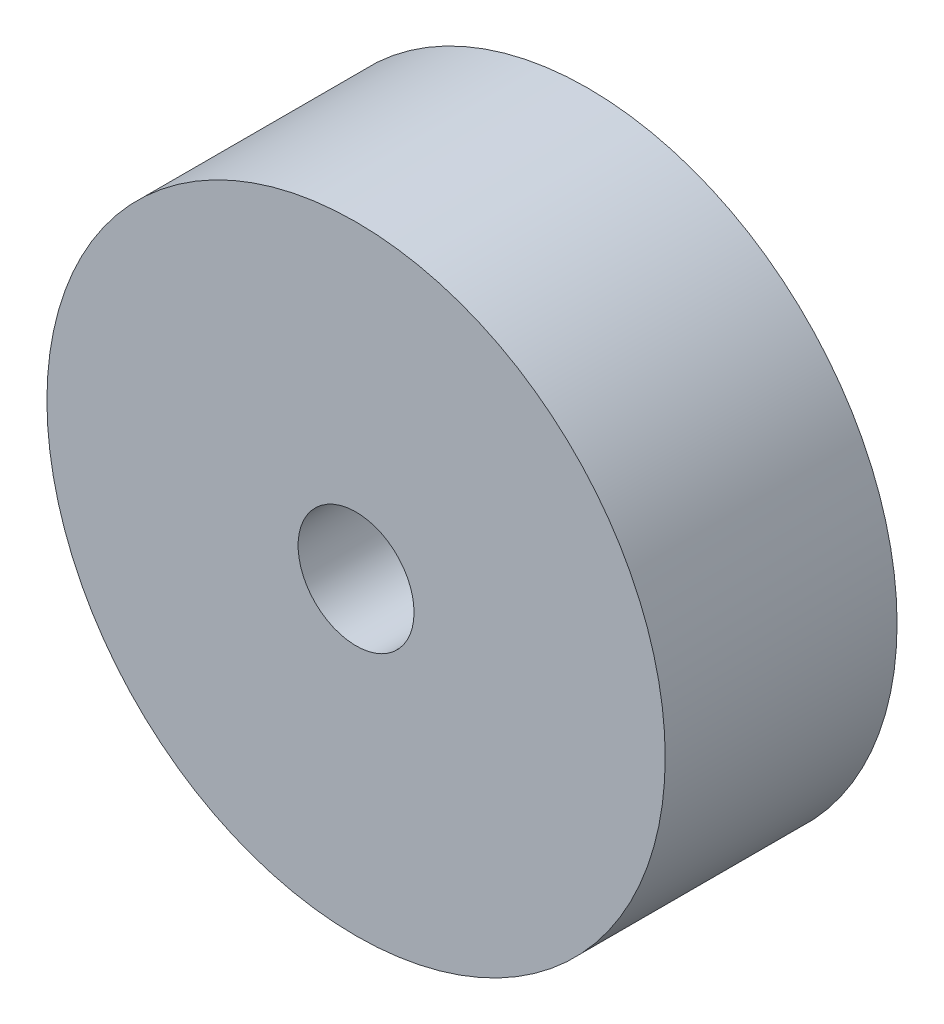
ISO-10303-21;
HEADER;
FILE_DESCRIPTION(('STEP AP214'),'2;1');
FILE_NAME('part.step','',(''),(''),'','','');
FILE_SCHEMA(('AUTOMOTIVE_DESIGN { 1 0 10303 214 1 1 1 1 }'));
ENDSEC;
DATA;
#1=APPLICATION_CONTEXT('core data for automotive mechanical design processes');
#2=APPLICATION_PROTOCOL_DEFINITION('international standard','automotive_design',2000,#1);
#3=PRODUCT_CONTEXT('',#1,'mechanical');
#4=PRODUCT('Part','Part','',(#3));
#5=PRODUCT_RELATED_PRODUCT_CATEGORY('part','',(#4));
#6=PRODUCT_DEFINITION_FORMATION('','',#4);
#7=PRODUCT_DEFINITION_CONTEXT('part definition',#1,'design');
#8=PRODUCT_DEFINITION('design','',#6,#7);
#9=PRODUCT_DEFINITION_SHAPE('','',#8);
#10=(LENGTH_UNIT() NAMED_UNIT(*) SI_UNIT(.MILLI.,.METRE.));
#11=(NAMED_UNIT(*) PLANE_ANGLE_UNIT() SI_UNIT($,.RADIAN.));
#12=(NAMED_UNIT(*) SI_UNIT($,.STERADIAN.) SOLID_ANGLE_UNIT());
#13=UNCERTAINTY_MEASURE_WITH_UNIT(LENGTH_MEASURE(1.E-05),#10,'distance_accuracy_value','');
#14=(GEOMETRIC_REPRESENTATION_CONTEXT(3) GLOBAL_UNCERTAINTY_ASSIGNED_CONTEXT((#13)) GLOBAL_UNIT_ASSIGNED_CONTEXT((#10,
#11,#12)) REPRESENTATION_CONTEXT('',''));
#15=CARTESIAN_POINT('',(0.,0.,0.));
#16=DIRECTION('',(0.,0.,1.));
#17=DIRECTION('',(1.,0.,0.));
#18=AXIS2_PLACEMENT_3D('',#15,#16,#17);
#19=CARTESIAN_POINT('',(0.,0.,76.2));
#20=DIRECTION('',(0.,0.,-1.));
#21=DIRECTION('',(-1.,0.,0.));
#22=AXIS2_PLACEMENT_3D('',#19,#20,#21);
#23=CYLINDRICAL_SURFACE('',#22,101.6);
#24=CARTESIAN_POINT('',(0.,0.,76.2));
#25=DIRECTION('',(0.,0.,1.));
#26=DIRECTION('',(1.,0.,0.));
#27=AXIS2_PLACEMENT_3D('',#24,#25,#26);
#28=CIRCLE('',#27,101.6);
#29=CARTESIAN_POINT('',(-101.6,0.,76.2));
#30=VERTEX_POINT('',#29);
#31=EDGE_CURVE('E10',#30,#30,#28,.T.);
#32=CARTESIAN_POINT('',(0.,0.,0.));
#33=DIRECTION('',(0.,0.,1.));
#34=DIRECTION('',(1.,0.,0.));
#35=AXIS2_PLACEMENT_3D('',#32,#33,#34);
#36=CIRCLE('',#35,101.6);
#37=CARTESIAN_POINT('',(-101.6,0.,0.));
#38=VERTEX_POINT('',#37);
#39=EDGE_CURVE('E40',#38,#38,#36,.T.);
#40=CARTESIAN_POINT('',(-101.6,0.,76.2));
#41=CARTESIAN_POINT('',(-101.6,0.,75.40625));
#42=CARTESIAN_POINT('',(-101.6,0.,74.6125));
#43=CARTESIAN_POINT('',(-101.6,0.,73.025));
#44=CARTESIAN_POINT('',(-101.6,0.,72.23125));
#45=CARTESIAN_POINT('',(-101.6,0.,70.64375));
#46=CARTESIAN_POINT('',(-101.6,0.,69.85));
#47=CARTESIAN_POINT('',(-101.6,0.,68.2625));
#48=CARTESIAN_POINT('',(-101.6,0.,67.46875));
#49=CARTESIAN_POINT('',(-101.6,0.,65.88125));
#50=CARTESIAN_POINT('',(-101.6,0.,65.0875));
#51=CARTESIAN_POINT('',(-101.6,0.,63.5));
#52=CARTESIAN_POINT('',(-101.6,0.,62.70625));
#53=CARTESIAN_POINT('',(-101.6,0.,61.11875));
#54=CARTESIAN_POINT('',(-101.6,0.,60.325));
#55=CARTESIAN_POINT('',(-101.6,0.,58.7375));
#56=CARTESIAN_POINT('',(-101.6,0.,57.94375));
#57=CARTESIAN_POINT('',(-101.6,0.,56.35625));
#58=CARTESIAN_POINT('',(-101.6,0.,55.5625));
#59=CARTESIAN_POINT('',(-101.6,0.,53.975));
#60=CARTESIAN_POINT('',(-101.6,0.,53.18125));
#61=CARTESIAN_POINT('',(-101.6,0.,51.59375));
#62=CARTESIAN_POINT('',(-101.6,0.,50.8));
#63=CARTESIAN_POINT('',(-101.6,0.,49.2125));
#64=CARTESIAN_POINT('',(-101.6,0.,48.41875));
#65=CARTESIAN_POINT('',(-101.6,0.,46.83125));
#66=CARTESIAN_POINT('',(-101.6,0.,46.0375));
#67=CARTESIAN_POINT('',(-101.6,0.,44.45));
#68=CARTESIAN_POINT('',(-101.6,0.,43.65625));
#69=CARTESIAN_POINT('',(-101.6,0.,42.06875));
#70=CARTESIAN_POINT('',(-101.6,0.,41.275));
#71=CARTESIAN_POINT('',(-101.6,0.,39.6875));
#72=CARTESIAN_POINT('',(-101.6,0.,38.89375));
#73=CARTESIAN_POINT('',(-101.6,0.,37.30625));
#74=CARTESIAN_POINT('',(-101.6,0.,36.5125));
#75=CARTESIAN_POINT('',(-101.6,0.,34.925));
#76=CARTESIAN_POINT('',(-101.6,0.,34.13125));
#77=CARTESIAN_POINT('',(-101.6,0.,32.54375));
#78=CARTESIAN_POINT('',(-101.6,0.,31.75));
#79=CARTESIAN_POINT('',(-101.6,0.,30.1625));
#80=CARTESIAN_POINT('',(-101.6,0.,29.36875));
#81=CARTESIAN_POINT('',(-101.6,0.,27.78125));
#82=CARTESIAN_POINT('',(-101.6,0.,26.9875));
#83=CARTESIAN_POINT('',(-101.6,0.,25.4));
#84=CARTESIAN_POINT('',(-101.6,0.,24.60625));
#85=CARTESIAN_POINT('',(-101.6,0.,23.01875));
#86=CARTESIAN_POINT('',(-101.6,0.,22.225));
#87=CARTESIAN_POINT('',(-101.6,0.,20.6375));
#88=CARTESIAN_POINT('',(-101.6,0.,19.84375));
#89=CARTESIAN_POINT('',(-101.6,0.,18.25625));
#90=CARTESIAN_POINT('',(-101.6,0.,17.4625));
#91=CARTESIAN_POINT('',(-101.6,0.,15.875));
#92=CARTESIAN_POINT('',(-101.6,0.,15.08125));
#93=CARTESIAN_POINT('',(-101.6,0.,13.49375));
#94=CARTESIAN_POINT('',(-101.6,0.,12.7));
#95=CARTESIAN_POINT('',(-101.6,0.,11.1125));
#96=CARTESIAN_POINT('',(-101.6,0.,10.31875));
#97=CARTESIAN_POINT('',(-101.6,0.,8.73125));
#98=CARTESIAN_POINT('',(-101.6,0.,7.93750000000001));
#99=CARTESIAN_POINT('',(-101.6,0.,6.35));
#100=CARTESIAN_POINT('',(-101.6,0.,5.55625));
#101=CARTESIAN_POINT('',(-101.6,0.,3.96875));
#102=CARTESIAN_POINT('',(-101.6,0.,3.175));
#103=CARTESIAN_POINT('',(-101.6,0.,1.5875));
#104=CARTESIAN_POINT('',(-101.6,0.,0.793750000000001));
#105=CARTESIAN_POINT('',(-101.6,0.,0.));
#106=B_SPLINE_CURVE_WITH_KNOTS('',3,(#40,#41,#42,#43,#44,#45,#46,#47,#48,#49,#50,#51,#52,#53,
#54,#55,#56,#57,#58,#59,#60,#61,#62,#63,#64,#65,#66,#67,#68,#69,#70,#71,#72,#73,#74,#75,#76,#77,
#78,#79,#80,#81,#82,#83,#84,#85,#86,#87,#88,#89,#90,#91,#92,#93,#94,#95,#96,#97,#98,#99,#100,
#101,#102,#103,#104,#105),.UNSPECIFIED.,.F.,.F.,(4,2,2,2,2,2,2,2,2,2,2,2,2,2,2,2,2,2,2,2,2,2,2,
2,2,2,2,2,2,2,2,2,4),(0.,2.38125,4.7625,7.14375,9.52500000000001,11.90625,14.2875,16.66875,
19.05,21.43125,23.8125,26.19375,28.575,30.95625,33.3375,35.71875,38.1,40.48125,42.8625,45.24375,
47.625,50.00625,52.3875,54.76875,57.15,59.53125,61.9125,64.29375,66.675,69.05625,71.4375,
73.81875,76.2),.UNSPECIFIED.);
#107=EDGE_CURVE('BSEAM37',#30,#38,#106,.T.);
#108=ORIENTED_EDGE('',*,*,#31,.F.);
#109=ORIENTED_EDGE('',*,*,#39,.T.);
#110=ORIENTED_EDGE('',*,*,#107,.T.);
#111=ORIENTED_EDGE('',*,*,#107,.F.);
#112=EDGE_LOOP('',(#108,#110,#109,#111));
#113=FACE_BOUND('',#112,.T.);
#114=ADVANCED_FACE('F37',(#113),#23,.T.);
#115=CARTESIAN_POINT('',(0.,0.,76.2));
#116=DIRECTION('',(0.,0.,1.));
#117=DIRECTION('',(1.,0.,0.));
#118=AXIS2_PLACEMENT_3D('',#115,#116,#117);
#119=PLANE('',#118);
#120=CARTESIAN_POINT('',(0.,0.,76.2));
#121=DIRECTION('',(0.,0.,1.));
#122=DIRECTION('',(1.,0.,0.));
#123=AXIS2_PLACEMENT_3D('',#120,#121,#122);
#124=CIRCLE('',#123,19.05);
#125=CARTESIAN_POINT('',(19.05,0.,76.2));
#126=VERTEX_POINT('',#125);
#127=EDGE_CURVE('E51',#126,#126,#124,.T.);
#128=ORIENTED_EDGE('',*,*,#127,.F.);
#129=EDGE_LOOP('',(#128));
#130=FACE_BOUND('',#129,.T.);
#131=ORIENTED_EDGE('',*,*,#31,.T.);
#132=EDGE_LOOP('',(#131));
#133=FACE_BOUND('',#132,.T.);
#134=ADVANCED_FACE('F68',(#130,#133),#119,.T.);
#135=CARTESIAN_POINT('',(0.,0.,0.));
#136=DIRECTION('',(0.,0.,1.));
#137=DIRECTION('',(1.,0.,0.));
#138=AXIS2_PLACEMENT_3D('',#135,#136,#137);
#139=PLANE('',#138);
#140=CARTESIAN_POINT('',(0.,0.,0.));
#141=DIRECTION('',(0.,0.,1.));
#142=DIRECTION('',(1.,0.,0.));
#143=AXIS2_PLACEMENT_3D('',#140,#141,#142);
#144=CIRCLE('',#143,19.05);
#145=CARTESIAN_POINT('',(19.05,0.,0.));
#146=VERTEX_POINT('',#145);
#147=EDGE_CURVE('E49',#146,#146,#144,.T.);
#148=ORIENTED_EDGE('',*,*,#147,.T.);
#149=EDGE_LOOP('',(#148));
#150=FACE_BOUND('',#149,.T.);
#151=ORIENTED_EDGE('',*,*,#39,.F.);
#152=EDGE_LOOP('',(#151));
#153=FACE_BOUND('',#152,.T.);
#154=ADVANCED_FACE('F59',(#150,#153),#139,.F.);
#155=CARTESIAN_POINT('',(0.,0.,0.));
#156=DIRECTION('',(0.,0.,1.));
#157=DIRECTION('',(1.,0.,0.));
#158=AXIS2_PLACEMENT_3D('',#155,#156,#157);
#159=CYLINDRICAL_SURFACE('',#158,19.05);
#160=CARTESIAN_POINT('',(19.05,0.,0.));
#161=CARTESIAN_POINT('',(19.05,0.,0.79375));
#162=CARTESIAN_POINT('',(19.05,0.,1.5875));
#163=CARTESIAN_POINT('',(19.05,0.,3.175));
#164=CARTESIAN_POINT('',(19.05,0.,3.96875));
#165=CARTESIAN_POINT('',(19.05,0.,5.55625));
#166=CARTESIAN_POINT('',(19.05,0.,6.35));
#167=CARTESIAN_POINT('',(19.05,0.,7.9375));
#168=CARTESIAN_POINT('',(19.05,0.,8.73125));
#169=CARTESIAN_POINT('',(19.05,0.,10.31875));
#170=CARTESIAN_POINT('',(19.05,0.,11.1125));
#171=CARTESIAN_POINT('',(19.05,0.,12.7));
#172=CARTESIAN_POINT('',(19.05,0.,13.49375));
#173=CARTESIAN_POINT('',(19.05,0.,15.08125));
#174=CARTESIAN_POINT('',(19.05,0.,15.875));
#175=CARTESIAN_POINT('',(19.05,0.,17.4625));
#176=CARTESIAN_POINT('',(19.05,0.,18.25625));
#177=CARTESIAN_POINT('',(19.05,0.,19.84375));
#178=CARTESIAN_POINT('',(19.05,0.,20.6375));
#179=CARTESIAN_POINT('',(19.05,0.,22.225));
#180=CARTESIAN_POINT('',(19.05,0.,23.01875));
#181=CARTESIAN_POINT('',(19.05,0.,24.60625));
#182=CARTESIAN_POINT('',(19.05,0.,25.4));
#183=CARTESIAN_POINT('',(19.05,0.,26.9875));
#184=CARTESIAN_POINT('',(19.05,0.,27.78125));
#185=CARTESIAN_POINT('',(19.05,0.,29.36875));
#186=CARTESIAN_POINT('',(19.05,0.,30.1625));
#187=CARTESIAN_POINT('',(19.05,0.,31.75));
#188=CARTESIAN_POINT('',(19.05,0.,32.54375));
#189=CARTESIAN_POINT('',(19.05,0.,34.13125));
#190=CARTESIAN_POINT('',(19.05,0.,34.925));
#191=CARTESIAN_POINT('',(19.05,0.,36.5125));
#192=CARTESIAN_POINT('',(19.05,0.,37.30625));
#193=CARTESIAN_POINT('',(19.05,0.,38.89375));
#194=CARTESIAN_POINT('',(19.05,0.,39.6875));
#195=CARTESIAN_POINT('',(19.05,0.,41.275));
#196=CARTESIAN_POINT('',(19.05,0.,42.06875));
#197=CARTESIAN_POINT('',(19.05,0.,43.65625));
#198=CARTESIAN_POINT('',(19.05,0.,44.45));
#199=CARTESIAN_POINT('',(19.05,0.,46.0375));
#200=CARTESIAN_POINT('',(19.05,0.,46.83125));
#201=CARTESIAN_POINT('',(19.05,0.,48.41875));
#202=CARTESIAN_POINT('',(19.05,0.,49.2125));
#203=CARTESIAN_POINT('',(19.05,0.,50.8));
#204=CARTESIAN_POINT('',(19.05,0.,51.59375));
#205=CARTESIAN_POINT('',(19.05,0.,53.18125));
#206=CARTESIAN_POINT('',(19.05,0.,53.975));
#207=CARTESIAN_POINT('',(19.05,0.,55.5625));
#208=CARTESIAN_POINT('',(19.05,0.,56.35625));
#209=CARTESIAN_POINT('',(19.05,0.,57.94375));
#210=CARTESIAN_POINT('',(19.05,0.,58.7375));
#211=CARTESIAN_POINT('',(19.05,0.,60.325));
#212=CARTESIAN_POINT('',(19.05,0.,61.11875));
#213=CARTESIAN_POINT('',(19.05,0.,62.70625));
#214=CARTESIAN_POINT('',(19.05,0.,63.5));
#215=CARTESIAN_POINT('',(19.05,0.,65.0875));
#216=CARTESIAN_POINT('',(19.05,0.,65.88125));
#217=CARTESIAN_POINT('',(19.05,0.,67.46875));
#218=CARTESIAN_POINT('',(19.05,0.,68.2625));
#219=CARTESIAN_POINT('',(19.05,0.,69.85));
#220=CARTESIAN_POINT('',(19.05,0.,70.64375));
#221=CARTESIAN_POINT('',(19.05,0.,72.23125));
#222=CARTESIAN_POINT('',(19.05,0.,73.025));
#223=CARTESIAN_POINT('',(19.05,0.,74.6125));
#224=CARTESIAN_POINT('',(19.05,0.,75.40625));
#225=CARTESIAN_POINT('',(19.05,0.,76.2));
#226=B_SPLINE_CURVE_WITH_KNOTS('',3,(#160,#161,#162,#163,#164,#165,#166,#167,#168,#169,#170,
#171,#172,#173,#174,#175,#176,#177,#178,#179,#180,#181,#182,#183,#184,#185,#186,#187,#188,#189,
#190,#191,#192,#193,#194,#195,#196,#197,#198,#199,#200,#201,#202,#203,#204,#205,#206,#207,#208,
#209,#210,#211,#212,#213,#214,#215,#216,#217,#218,#219,#220,#221,#222,#223,#224,#225),
.UNSPECIFIED.,.F.,.F.,(4,2,2,2,2,2,2,2,2,2,2,2,2,2,2,2,2,2,2,2,2,2,2,2,2,2,2,2,2,2,2,2,4),(0.,
2.38125,4.7625,7.14375,9.525,11.90625,14.2875,16.66875,19.05,21.43125,23.8125,26.19375,28.575,
30.95625,33.3375,35.71875,38.1,40.48125,42.8625,45.24375,47.625,50.00625,52.3875,54.76875,57.15,
59.53125,61.9125,64.29375,66.675,69.05625,71.4375,73.81875,76.2),.UNSPECIFIED.);
#227=EDGE_CURVE('BSEAM62',#146,#126,#226,.T.);
#228=ORIENTED_EDGE('',*,*,#147,.F.);
#229=ORIENTED_EDGE('',*,*,#127,.T.);
#230=ORIENTED_EDGE('',*,*,#227,.T.);
#231=ORIENTED_EDGE('',*,*,#227,.F.);
#232=EDGE_LOOP('',(#228,#230,#229,#231));
#233=FACE_BOUND('',#232,.T.);
#234=ADVANCED_FACE('F62',(#233),#159,.F.);
#235=CLOSED_SHELL('',(#114,#134,#154,#234));
#236=MANIFOLD_SOLID_BREP('B2',#235);
#237=ADVANCED_BREP_SHAPE_REPRESENTATION('',(#18,#236),#14);
#238=SHAPE_DEFINITION_REPRESENTATION(#9,#237);
ENDSEC;
END-ISO-10303-21;
